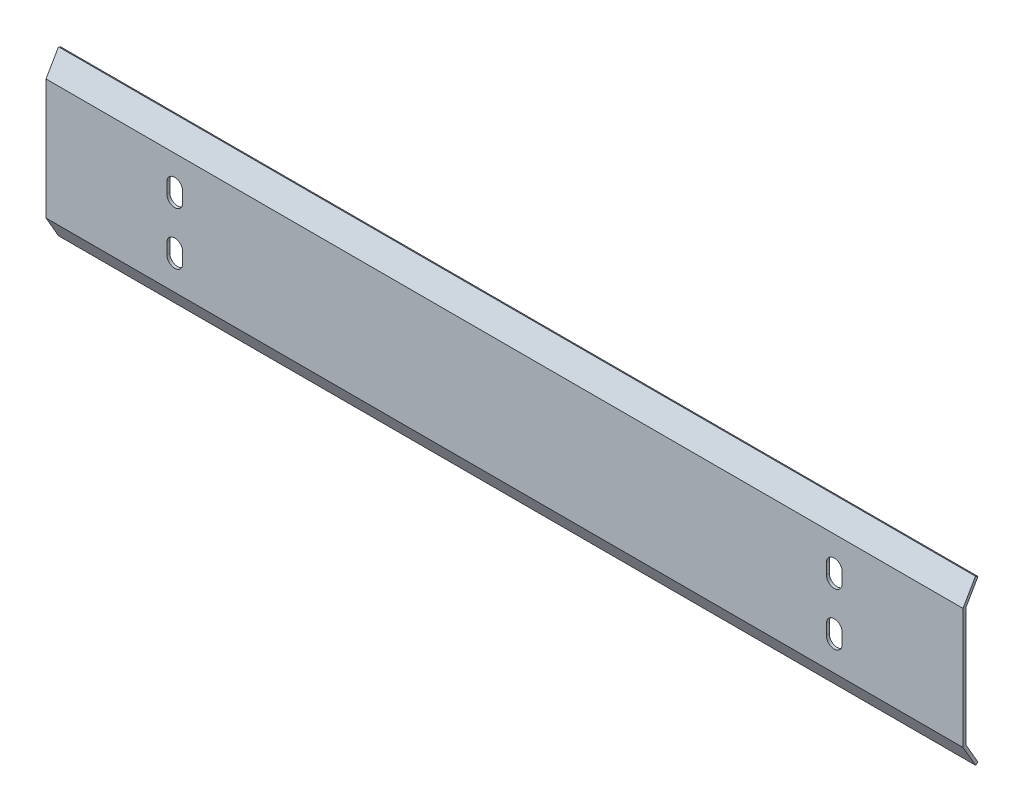
ISO-10303-21;
HEADER;
FILE_DESCRIPTION(('STEP AP214'),'2;1');
FILE_NAME('part.step','',(''),(''),'','','');
FILE_SCHEMA(('AUTOMOTIVE_DESIGN { 1 0 10303 214 1 1 1 1 }'));
ENDSEC;
DATA;
#1=APPLICATION_CONTEXT('core data for automotive mechanical design processes');
#2=APPLICATION_PROTOCOL_DEFINITION('international standard','automotive_design',2000,#1);
#3=PRODUCT_CONTEXT('',#1,'mechanical');
#4=PRODUCT('Part','Part','',(#3));
#5=PRODUCT_RELATED_PRODUCT_CATEGORY('part','',(#4));
#6=PRODUCT_DEFINITION_FORMATION('','',#4);
#7=PRODUCT_DEFINITION_CONTEXT('part definition',#1,'design');
#8=PRODUCT_DEFINITION('design','',#6,#7);
#9=PRODUCT_DEFINITION_SHAPE('','',#8);
#10=(LENGTH_UNIT() NAMED_UNIT(*) SI_UNIT(.MILLI.,.METRE.));
#11=(NAMED_UNIT(*) PLANE_ANGLE_UNIT() SI_UNIT($,.RADIAN.));
#12=(NAMED_UNIT(*) SI_UNIT($,.STERADIAN.) SOLID_ANGLE_UNIT());
#13=UNCERTAINTY_MEASURE_WITH_UNIT(LENGTH_MEASURE(1.E-05),#10,'distance_accuracy_value','');
#14=(GEOMETRIC_REPRESENTATION_CONTEXT(3) GLOBAL_UNCERTAINTY_ASSIGNED_CONTEXT((#13)) GLOBAL_UNIT_ASSIGNED_CONTEXT((#10,
#11,#12)) REPRESENTATION_CONTEXT('',''));
#15=CARTESIAN_POINT('',(0.,0.,0.));
#16=DIRECTION('',(0.,0.,1.));
#17=DIRECTION('',(1.,0.,0.));
#18=AXIS2_PLACEMENT_3D('',#15,#16,#17);
#19=CARTESIAN_POINT('',(-349.,0.294744111674232,-1.1));
#20=DIRECTION('',(0.,0.,-1.));
#21=DIRECTION('',(-1.,0.,0.));
#22=AXIS2_PLACEMENT_3D('',#19,#20,#21);
#23=PLANE('',#22);
#24=CARTESIAN_POINT('',(-300.,14.9227586640478,-1.1));
#25=DIRECTION('',(0.,0.,-1.));
#26=DIRECTION('',(-1.,0.,0.));
#27=AXIS2_PLACEMENT_3D('',#24,#25,#26);
#28=CIRCLE('',#27,3.);
#29=CARTESIAN_POINT('',(-303.,14.9227586640478,-1.1));
#30=VERTEX_POINT('',#29);
#31=CARTESIAN_POINT('',(-297.,14.9227586640478,-1.1));
#32=VERTEX_POINT('',#31);
#33=EDGE_CURVE('E229',#30,#32,#28,.T.);
#34=ORIENTED_EDGE('',*,*,#33,.F.);
#35=DIRECTION('',(0.,1.,0.));
#36=VECTOR('',#35,1.);
#37=CARTESIAN_POINT('',(-303.,0.294744111674232,-1.1));
#38=LINE('',#37,#36);
#39=CARTESIAN_POINT('',(-303.,10.9227586640478,-1.1));
#40=VERTEX_POINT('',#39);
#41=EDGE_CURVE('E222',#40,#30,#38,.T.);
#42=ORIENTED_EDGE('',*,*,#41,.F.);
#43=CARTESIAN_POINT('',(-300.,10.9227586640478,-1.1));
#44=DIRECTION('',(0.,0.,-1.));
#45=DIRECTION('',(-1.,0.,0.));
#46=AXIS2_PLACEMENT_3D('',#43,#44,#45);
#47=CIRCLE('',#46,3.);
#48=CARTESIAN_POINT('',(-297.,10.9227586640478,-1.1));
#49=VERTEX_POINT('',#48);
#50=EDGE_CURVE('E202',#49,#40,#47,.T.);
#51=ORIENTED_EDGE('',*,*,#50,.F.);
#52=DIRECTION('',(0.,-1.,0.));
#53=VECTOR('',#52,1.);
#54=CARTESIAN_POINT('',(-297.,0.294744111674232,-1.1));
#55=LINE('',#54,#53);
#56=EDGE_CURVE('E227',#32,#49,#55,.T.);
#57=ORIENTED_EDGE('',*,*,#56,.F.);
#58=EDGE_LOOP('',(#34,#42,#51,#57));
#59=FACE_BOUND('',#58,.T.);
#60=CARTESIAN_POINT('',(-49.,14.9227586640478,-1.1));
#61=DIRECTION('',(0.,0.,-1.));
#62=DIRECTION('',(-1.,0.,0.));
#63=AXIS2_PLACEMENT_3D('',#60,#61,#62);
#64=CIRCLE('',#63,3.);
#65=CARTESIAN_POINT('',(-52.,14.9227586640478,-1.1));
#66=VERTEX_POINT('',#65);
#67=CARTESIAN_POINT('',(-46.,14.9227586640478,-1.1));
#68=VERTEX_POINT('',#67);
#69=EDGE_CURVE('E324',#66,#68,#64,.T.);
#70=ORIENTED_EDGE('',*,*,#69,.F.);
#71=DIRECTION('',(0.,1.,0.));
#72=VECTOR('',#71,1.);
#73=CARTESIAN_POINT('',(-52.,0.294744111674232,-1.1));
#74=LINE('',#73,#72);
#75=CARTESIAN_POINT('',(-52.,10.9227586640478,-1.1));
#76=VERTEX_POINT('',#75);
#77=EDGE_CURVE('E311',#76,#66,#74,.T.);
#78=ORIENTED_EDGE('',*,*,#77,.F.);
#79=CARTESIAN_POINT('',(-49.,10.9227586640478,-1.1));
#80=DIRECTION('',(0.,0.,-1.));
#81=DIRECTION('',(-1.,0.,0.));
#82=AXIS2_PLACEMENT_3D('',#79,#80,#81);
#83=CIRCLE('',#82,3.);
#84=CARTESIAN_POINT('',(-46.,10.9227586640478,-1.1));
#85=VERTEX_POINT('',#84);
#86=EDGE_CURVE('E319',#85,#76,#83,.T.);
#87=ORIENTED_EDGE('',*,*,#86,.F.);
#88=DIRECTION('',(0.,-1.,0.));
#89=VECTOR('',#88,1.);
#90=CARTESIAN_POINT('',(-46.,0.294744111674232,-1.1));
#91=LINE('',#90,#89);
#92=EDGE_CURVE('E322',#68,#85,#91,.T.);
#93=ORIENTED_EDGE('',*,*,#92,.F.);
#94=EDGE_LOOP('',(#70,#78,#87,#93));
#95=FACE_BOUND('',#94,.T.);
#96=DIRECTION('',(0.,1.,0.));
#97=VECTOR('',#96,1.);
#98=CARTESIAN_POINT('',(0.,0.294744111674232,-1.1));
#99=LINE('',#98,#97);
#100=CARTESIAN_POINT('',(0.,0.294744111674232,-1.1));
#101=VERTEX_POINT('',#100);
#102=CARTESIAN_POINT('',(0.,45.5507732164214,-1.1));
#103=VERTEX_POINT('',#102);
#104=EDGE_CURVE('E326',#101,#103,#99,.T.);
#105=ORIENTED_EDGE('',*,*,#104,.F.);
#106=DIRECTION('',(1.,0.,0.));
#107=VECTOR('',#106,1.);
#108=CARTESIAN_POINT('',(-349.,0.294744111674232,-1.1));
#109=LINE('',#108,#107);
#110=CARTESIAN_POINT('',(-349.,0.294744111674232,-1.1));
#111=VERTEX_POINT('',#110);
#112=EDGE_CURVE('E11',#111,#101,#109,.T.);
#113=ORIENTED_EDGE('',*,*,#112,.F.);
#114=DIRECTION('',(0.,1.,0.));
#115=VECTOR('',#114,1.);
#116=CARTESIAN_POINT('',(-349.,0.294744111674232,-1.1));
#117=LINE('',#116,#115);
#118=CARTESIAN_POINT('',(-349.,45.5507732164214,-1.1));
#119=VERTEX_POINT('',#118);
#120=EDGE_CURVE('E327',#111,#119,#117,.T.);
#121=ORIENTED_EDGE('',*,*,#120,.T.);
#122=DIRECTION('',(1.,0.,0.));
#123=VECTOR('',#122,1.);
#124=CARTESIAN_POINT('',(-349.,45.5507732164214,-1.1));
#125=LINE('',#124,#123);
#126=EDGE_CURVE('E38',#119,#103,#125,.T.);
#127=ORIENTED_EDGE('',*,*,#126,.T.);
#128=EDGE_LOOP('',(#105,#113,#121,#127));
#129=FACE_BOUND('',#128,.T.);
#130=DIRECTION('',(0.,-1.,0.));
#131=VECTOR('',#130,1.);
#132=CARTESIAN_POINT('',(-52.,0.294744111674232,-1.1));
#133=LINE('',#132,#131);
#134=CARTESIAN_POINT('',(-52.,34.9227586640481,-1.1));
#135=VERTEX_POINT('',#134);
#136=CARTESIAN_POINT('',(-52.,30.9227586640481,-1.1));
#137=VERTEX_POINT('',#136);
#138=EDGE_CURVE('E291',#135,#137,#133,.T.);
#139=ORIENTED_EDGE('',*,*,#138,.T.);
#140=CARTESIAN_POINT('',(-49.,30.9227586640481,-1.1));
#141=DIRECTION('',(0.,0.,-1.));
#142=DIRECTION('',(-1.,0.,0.));
#143=AXIS2_PLACEMENT_3D('',#140,#141,#142);
#144=CIRCLE('',#143,3.);
#145=CARTESIAN_POINT('',(-46.,30.9227586640481,-1.1));
#146=VERTEX_POINT('',#145);
#147=EDGE_CURVE('E294',#137,#146,#144,.F.);
#148=ORIENTED_EDGE('',*,*,#147,.T.);
#149=DIRECTION('',(0.,1.,0.));
#150=VECTOR('',#149,1.);
#151=CARTESIAN_POINT('',(-46.,0.294744111674232,-1.1));
#152=LINE('',#151,#150);
#153=CARTESIAN_POINT('',(-46.,34.9227586640481,-1.1));
#154=VERTEX_POINT('',#153);
#155=EDGE_CURVE('E279',#146,#154,#152,.T.);
#156=ORIENTED_EDGE('',*,*,#155,.T.);
#157=CARTESIAN_POINT('',(-49.,34.9227586640481,-1.1));
#158=DIRECTION('',(0.,0.,-1.));
#159=DIRECTION('',(-1.,0.,0.));
#160=AXIS2_PLACEMENT_3D('',#157,#158,#159);
#161=CIRCLE('',#160,3.);
#162=EDGE_CURVE('E288',#154,#135,#161,.F.);
#163=ORIENTED_EDGE('',*,*,#162,.T.);
#164=EDGE_LOOP('',(#139,#148,#156,#163));
#165=FACE_BOUND('',#164,.T.);
#166=DIRECTION('',(0.,-1.,0.));
#167=VECTOR('',#166,1.);
#168=CARTESIAN_POINT('',(-303.,0.294744111674232,-1.1));
#169=LINE('',#168,#167);
#170=CARTESIAN_POINT('',(-303.,34.9227586640481,-1.1));
#171=VERTEX_POINT('',#170);
#172=CARTESIAN_POINT('',(-303.,30.9227586640481,-1.1));
#173=VERTEX_POINT('',#172);
#174=EDGE_CURVE('E258',#171,#173,#169,.T.);
#175=ORIENTED_EDGE('',*,*,#174,.T.);
#176=CARTESIAN_POINT('',(-300.,30.9227586640481,-1.1));
#177=DIRECTION('',(0.,0.,-1.));
#178=DIRECTION('',(-1.,0.,0.));
#179=AXIS2_PLACEMENT_3D('',#176,#177,#178);
#180=CIRCLE('',#179,3.);
#181=CARTESIAN_POINT('',(-297.,30.9227586640481,-1.1));
#182=VERTEX_POINT('',#181);
#183=EDGE_CURVE('E261',#173,#182,#180,.F.);
#184=ORIENTED_EDGE('',*,*,#183,.T.);
#185=DIRECTION('',(0.,1.,0.));
#186=VECTOR('',#185,1.);
#187=CARTESIAN_POINT('',(-297.,0.294744111674232,-1.1));
#188=LINE('',#187,#186);
#189=CARTESIAN_POINT('',(-297.,34.9227586640481,-1.1));
#190=VERTEX_POINT('',#189);
#191=EDGE_CURVE('E246',#182,#190,#188,.T.);
#192=ORIENTED_EDGE('',*,*,#191,.T.);
#193=CARTESIAN_POINT('',(-300.,34.9227586640481,-1.1));
#194=DIRECTION('',(0.,0.,-1.));
#195=DIRECTION('',(-1.,0.,0.));
#196=AXIS2_PLACEMENT_3D('',#193,#194,#195);
#197=CIRCLE('',#196,3.);
#198=EDGE_CURVE('E255',#190,#171,#197,.F.);
#199=ORIENTED_EDGE('',*,*,#198,.T.);
#200=EDGE_LOOP('',(#175,#184,#192,#199));
#201=FACE_BOUND('',#200,.T.);
#202=ADVANCED_FACE('F35',(#59,#95,#129,#165,#201),#23,.T.);
#203=CARTESIAN_POINT('',(-349.,0.,0.));
#204=DIRECTION('',(0.,0.,1.));
#205=DIRECTION('',(0.,-1.,0.));
#206=AXIS2_PLACEMENT_3D('',#203,#204,#205);
#207=PLANE('',#206);
#208=CARTESIAN_POINT('',(-300.,14.9227586640478,0.));
#209=DIRECTION('',(0.,0.,1.));
#210=DIRECTION('',(1.,0.,0.));
#211=AXIS2_PLACEMENT_3D('',#208,#209,#210);
#212=CIRCLE('',#211,3.);
#213=CARTESIAN_POINT('',(-297.,14.9227586640478,0.));
#214=VERTEX_POINT('',#213);
#215=CARTESIAN_POINT('',(-303.,14.9227586640478,0.));
#216=VERTEX_POINT('',#215);
#217=EDGE_CURVE('E59',#214,#216,#212,.T.);
#218=ORIENTED_EDGE('',*,*,#217,.F.);
#219=DIRECTION('',(0.,1.,0.));
#220=VECTOR('',#219,1.);
#221=CARTESIAN_POINT('',(-297.,14.9227586640478,0.));
#222=LINE('',#221,#220);
#223=CARTESIAN_POINT('',(-297.,10.9227586640478,0.));
#224=VERTEX_POINT('',#223);
#225=EDGE_CURVE('E215',#224,#214,#222,.T.);
#226=ORIENTED_EDGE('',*,*,#225,.F.);
#227=CARTESIAN_POINT('',(-300.,10.9227586640478,0.));
#228=DIRECTION('',(0.,0.,1.));
#229=DIRECTION('',(1.,0.,0.));
#230=AXIS2_PLACEMENT_3D('',#227,#228,#229);
#231=CIRCLE('',#230,3.);
#232=CARTESIAN_POINT('',(-303.,10.9227586640478,0.));
#233=VERTEX_POINT('',#232);
#234=EDGE_CURVE('E199',#233,#224,#231,.T.);
#235=ORIENTED_EDGE('',*,*,#234,.F.);
#236=DIRECTION('',(0.,-1.,0.));
#237=VECTOR('',#236,1.);
#238=CARTESIAN_POINT('',(-303.,14.9227586640478,0.));
#239=LINE('',#238,#237);
#240=EDGE_CURVE('E208',#216,#233,#239,.T.);
#241=ORIENTED_EDGE('',*,*,#240,.F.);
#242=EDGE_LOOP('',(#218,#226,#235,#241));
#243=FACE_BOUND('',#242,.T.);
#244=CARTESIAN_POINT('',(-49.,14.9227586640478,0.));
#245=DIRECTION('',(0.,0.,1.));
#246=DIRECTION('',(1.,0.,0.));
#247=AXIS2_PLACEMENT_3D('',#244,#245,#246);
#248=CIRCLE('',#247,3.);
#249=CARTESIAN_POINT('',(-46.,14.9227586640478,0.));
#250=VERTEX_POINT('',#249);
#251=CARTESIAN_POINT('',(-52.,14.9227586640478,0.));
#252=VERTEX_POINT('',#251);
#253=EDGE_CURVE('E297',#250,#252,#248,.T.);
#254=ORIENTED_EDGE('',*,*,#253,.F.);
#255=DIRECTION('',(0.,1.,0.));
#256=VECTOR('',#255,1.);
#257=CARTESIAN_POINT('',(-46.,14.9227586640478,0.));
#258=LINE('',#257,#256);
#259=CARTESIAN_POINT('',(-46.,10.9227586640478,0.));
#260=VERTEX_POINT('',#259);
#261=EDGE_CURVE('E305',#260,#250,#258,.T.);
#262=ORIENTED_EDGE('',*,*,#261,.F.);
#263=CARTESIAN_POINT('',(-49.,10.9227586640478,0.));
#264=DIRECTION('',(0.,0.,1.));
#265=DIRECTION('',(1.,0.,0.));
#266=AXIS2_PLACEMENT_3D('',#263,#264,#265);
#267=CIRCLE('',#266,3.);
#268=CARTESIAN_POINT('',(-52.,10.9227586640478,0.));
#269=VERTEX_POINT('',#268);
#270=EDGE_CURVE('E302',#269,#260,#267,.T.);
#271=ORIENTED_EDGE('',*,*,#270,.F.);
#272=DIRECTION('',(0.,-1.,0.));
#273=VECTOR('',#272,1.);
#274=CARTESIAN_POINT('',(-52.,14.9227586640478,0.));
#275=LINE('',#274,#273);
#276=EDGE_CURVE('E299',#252,#269,#275,.T.);
#277=ORIENTED_EDGE('',*,*,#276,.F.);
#278=EDGE_LOOP('',(#254,#262,#271,#277));
#279=FACE_BOUND('',#278,.T.);
#280=DIRECTION('',(0.,-1.,0.));
#281=VECTOR('',#280,1.);
#282=CARTESIAN_POINT('',(0.,0.,0.));
#283=LINE('',#282,#281);
#284=CARTESIAN_POINT('',(0.,45.8455173280956,0.));
#285=VERTEX_POINT('',#284);
#286=CARTESIAN_POINT('',(0.,0.,0.));
#287=VERTEX_POINT('',#286);
#288=EDGE_CURVE('E363',#285,#287,#283,.T.);
#289=ORIENTED_EDGE('',*,*,#288,.F.);
#290=DIRECTION('',(1.,0.,0.));
#291=VECTOR('',#290,1.);
#292=CARTESIAN_POINT('',(-349.,45.8455173280956,0.));
#293=LINE('',#292,#291);
#294=CARTESIAN_POINT('',(-349.,45.8455173280956,0.));
#295=VERTEX_POINT('',#294);
#296=EDGE_CURVE('E379',#295,#285,#293,.T.);
#297=ORIENTED_EDGE('',*,*,#296,.F.);
#298=DIRECTION('',(0.,-1.,0.));
#299=VECTOR('',#298,1.);
#300=CARTESIAN_POINT('',(-349.,0.,0.));
#301=LINE('',#300,#299);
#302=CARTESIAN_POINT('',(-349.,0.,0.));
#303=VERTEX_POINT('',#302);
#304=EDGE_CURVE('E340',#295,#303,#301,.T.);
#305=ORIENTED_EDGE('',*,*,#304,.T.);
#306=DIRECTION('',(1.,0.,0.));
#307=VECTOR('',#306,1.);
#308=CARTESIAN_POINT('',(-349.,0.,0.));
#309=LINE('',#308,#307);
#310=EDGE_CURVE('E377',#303,#287,#309,.T.);
#311=ORIENTED_EDGE('',*,*,#310,.T.);
#312=EDGE_LOOP('',(#289,#297,#305,#311));
#313=FACE_BOUND('',#312,.T.);
#314=DIRECTION('',(0.,-1.,0.));
#315=VECTOR('',#314,1.);
#316=CARTESIAN_POINT('',(-46.,30.9227586640481,0.));
#317=LINE('',#316,#315);
#318=CARTESIAN_POINT('',(-46.,34.9227586640481,0.));
#319=VERTEX_POINT('',#318);
#320=CARTESIAN_POINT('',(-46.,30.9227586640481,0.));
#321=VERTEX_POINT('',#320);
#322=EDGE_CURVE('E267',#319,#321,#317,.T.);
#323=ORIENTED_EDGE('',*,*,#322,.T.);
#324=CARTESIAN_POINT('',(-49.,30.9227586640481,0.));
#325=DIRECTION('',(0.,0.,-1.));
#326=DIRECTION('',(1.,0.,0.));
#327=AXIS2_PLACEMENT_3D('',#324,#325,#326);
#328=CIRCLE('',#327,3.);
#329=CARTESIAN_POINT('',(-52.,30.9227586640481,0.));
#330=VERTEX_POINT('',#329);
#331=EDGE_CURVE('E264',#321,#330,#328,.T.);
#332=ORIENTED_EDGE('',*,*,#331,.T.);
#333=DIRECTION('',(0.,1.,0.));
#334=VECTOR('',#333,1.);
#335=CARTESIAN_POINT('',(-52.,30.9227586640481,0.));
#336=LINE('',#335,#334);
#337=CARTESIAN_POINT('',(-52.,34.9227586640481,0.));
#338=VERTEX_POINT('',#337);
#339=EDGE_CURVE('E273',#330,#338,#336,.T.);
#340=ORIENTED_EDGE('',*,*,#339,.T.);
#341=CARTESIAN_POINT('',(-49.,34.9227586640481,0.));
#342=DIRECTION('',(0.,0.,-1.));
#343=DIRECTION('',(1.,0.,0.));
#344=AXIS2_PLACEMENT_3D('',#341,#342,#343);
#345=CIRCLE('',#344,3.);
#346=EDGE_CURVE('E270',#338,#319,#345,.T.);
#347=ORIENTED_EDGE('',*,*,#346,.T.);
#348=EDGE_LOOP('',(#323,#332,#340,#347));
#349=FACE_BOUND('',#348,.T.);
#350=DIRECTION('',(0.,-1.,0.));
#351=VECTOR('',#350,1.);
#352=CARTESIAN_POINT('',(-297.,30.9227586640481,0.));
#353=LINE('',#352,#351);
#354=CARTESIAN_POINT('',(-297.,34.9227586640481,0.));
#355=VERTEX_POINT('',#354);
#356=CARTESIAN_POINT('',(-297.,30.9227586640481,0.));
#357=VERTEX_POINT('',#356);
#358=EDGE_CURVE('E234',#355,#357,#353,.T.);
#359=ORIENTED_EDGE('',*,*,#358,.T.);
#360=CARTESIAN_POINT('',(-300.,30.9227586640481,0.));
#361=DIRECTION('',(0.,0.,-1.));
#362=DIRECTION('',(1.,0.,0.));
#363=AXIS2_PLACEMENT_3D('',#360,#361,#362);
#364=CIRCLE('',#363,3.);
#365=CARTESIAN_POINT('',(-303.,30.9227586640481,0.));
#366=VERTEX_POINT('',#365);
#367=EDGE_CURVE('E231',#357,#366,#364,.T.);
#368=ORIENTED_EDGE('',*,*,#367,.T.);
#369=DIRECTION('',(0.,1.,0.));
#370=VECTOR('',#369,1.);
#371=CARTESIAN_POINT('',(-303.,30.9227586640481,0.));
#372=LINE('',#371,#370);
#373=CARTESIAN_POINT('',(-303.,34.9227586640481,0.));
#374=VERTEX_POINT('',#373);
#375=EDGE_CURVE('E240',#366,#374,#372,.T.);
#376=ORIENTED_EDGE('',*,*,#375,.T.);
#377=CARTESIAN_POINT('',(-300.,34.9227586640481,0.));
#378=DIRECTION('',(0.,0.,-1.));
#379=DIRECTION('',(1.,0.,0.));
#380=AXIS2_PLACEMENT_3D('',#377,#378,#379);
#381=CIRCLE('',#380,3.);
#382=EDGE_CURVE('E237',#374,#355,#381,.T.);
#383=ORIENTED_EDGE('',*,*,#382,.T.);
#384=EDGE_LOOP('',(#359,#368,#376,#383));
#385=FACE_BOUND('',#384,.T.);
#386=ADVANCED_FACE('F212',(#243,#279,#313,#349,#385),#207,.T.);
#387=CARTESIAN_POINT('',(-349.,0.294744111674232,-1.1));
#388=DIRECTION('',(0.,0.499999999999995,-0.866025403784442));
#389=DIRECTION('',(0.,0.866025403784442,0.499999999999995));
#390=AXIS2_PLACEMENT_3D('',#387,#388,#389);
#391=PLANE('',#390);
#392=DIRECTION('',(0.,0.866025403784442,0.499999999999995));
#393=VECTOR('',#392,1.);
#394=CARTESIAN_POINT('',(0.,0.294744111674232,-1.1));
#395=LINE('',#394,#393);
#396=CARTESIAN_POINT('',(0.,-7.67724133595221,-5.70262794416284));
#397=VERTEX_POINT('',#396);
#398=EDGE_CURVE('E331',#397,#101,#395,.T.);
#399=ORIENTED_EDGE('',*,*,#398,.F.);
#400=DIRECTION('',(1.,0.,0.));
#401=VECTOR('',#400,1.);
#402=CARTESIAN_POINT('',(-349.,-7.67724133595221,-5.70262794416284));
#403=LINE('',#402,#401);
#404=CARTESIAN_POINT('',(-349.,-7.67724133595221,-5.70262794416284));
#405=VERTEX_POINT('',#404);
#406=EDGE_CURVE('E43',#405,#397,#403,.T.);
#407=ORIENTED_EDGE('',*,*,#406,.F.);
#408=DIRECTION('',(0.,0.866025403784442,0.499999999999995));
#409=VECTOR('',#408,1.);
#410=CARTESIAN_POINT('',(-349.,0.294744111674232,-1.1));
#411=LINE('',#410,#409);
#412=EDGE_CURVE('E349',#405,#111,#411,.T.);
#413=ORIENTED_EDGE('',*,*,#412,.T.);
#414=ORIENTED_EDGE('',*,*,#112,.T.);
#415=EDGE_LOOP('',(#399,#407,#413,#414));
#416=FACE_BOUND('',#415,.T.);
#417=ADVANCED_FACE('F397',(#416),#391,.T.);
#418=CARTESIAN_POINT('',(-349.,-8.2272413359522,-4.74999999999995));
#419=DIRECTION('',(0.,-0.866025403784444,-0.499999999999991));
#420=DIRECTION('',(0.,0.499999999999991,-0.866025403784444));
#421=AXIS2_PLACEMENT_3D('',#418,#419,#420);
#422=PLANE('',#421);
#423=DIRECTION('',(0.,0.499999999999991,-0.866025403784444));
#424=VECTOR('',#423,1.);
#425=CARTESIAN_POINT('',(0.,-8.2272413359522,-4.74999999999995));
#426=LINE('',#425,#424);
#427=CARTESIAN_POINT('',(0.,-8.2272413359522,-4.74999999999995));
#428=VERTEX_POINT('',#427);
#429=EDGE_CURVE('E369',#428,#397,#426,.T.);
#430=ORIENTED_EDGE('',*,*,#429,.F.);
#431=DIRECTION('',(1.,0.,0.));
#432=VECTOR('',#431,1.);
#433=CARTESIAN_POINT('',(-349.,-8.2272413359522,-4.74999999999995));
#434=LINE('',#433,#432);
#435=CARTESIAN_POINT('',(-349.,-8.2272413359522,-4.74999999999995));
#436=VERTEX_POINT('',#435);
#437=EDGE_CURVE('E375',#436,#428,#434,.T.);
#438=ORIENTED_EDGE('',*,*,#437,.F.);
#439=DIRECTION('',(0.,0.499999999999991,-0.866025403784444));
#440=VECTOR('',#439,1.);
#441=CARTESIAN_POINT('',(-349.,-8.2272413359522,-4.74999999999995));
#442=LINE('',#441,#440);
#443=EDGE_CURVE('E346',#436,#405,#442,.T.);
#444=ORIENTED_EDGE('',*,*,#443,.T.);
#445=ORIENTED_EDGE('',*,*,#406,.T.);
#446=EDGE_LOOP('',(#430,#438,#444,#445));
#447=FACE_BOUND('',#446,.T.);
#448=ADVANCED_FACE('F418',(#447),#422,.T.);
#449=CARTESIAN_POINT('',(-349.,0.,0.));
#450=DIRECTION('',(0.,-0.499999999999995,0.866025403784442));
#451=DIRECTION('',(0.,-0.866025403784442,-0.499999999999995));
#452=AXIS2_PLACEMENT_3D('',#449,#450,#451);
#453=PLANE('',#452);
#454=DIRECTION('',(0.,-0.866025403784442,-0.499999999999995));
#455=VECTOR('',#454,1.);
#456=CARTESIAN_POINT('',(0.,0.,0.));
#457=LINE('',#456,#455);
#458=EDGE_CURVE('E366',#287,#428,#457,.T.);
#459=ORIENTED_EDGE('',*,*,#458,.F.);
#460=ORIENTED_EDGE('',*,*,#310,.F.);
#461=DIRECTION('',(0.,-0.866025403784442,-0.499999999999995));
#462=VECTOR('',#461,1.);
#463=CARTESIAN_POINT('',(-349.,0.,0.));
#464=LINE('',#463,#462);
#465=EDGE_CURVE('E343',#303,#436,#464,.T.);
#466=ORIENTED_EDGE('',*,*,#465,.T.);
#467=ORIENTED_EDGE('',*,*,#437,.T.);
#468=EDGE_LOOP('',(#459,#460,#466,#467));
#469=FACE_BOUND('',#468,.T.);
#470=ADVANCED_FACE('F416',(#469),#453,.T.);
#471=CARTESIAN_POINT('',(-349.,45.8455173280956,0.));
#472=DIRECTION('',(0.,0.500000000000001,0.866025403784438));
#473=DIRECTION('',(0.,-0.866025403784438,0.500000000000001));
#474=AXIS2_PLACEMENT_3D('',#471,#472,#473);
#475=PLANE('',#474);
#476=DIRECTION('',(0.,-0.866025403784438,0.500000000000001));
#477=VECTOR('',#476,1.);
#478=CARTESIAN_POINT('',(0.,45.8455173280956,0.));
#479=LINE('',#478,#477);
#480=CARTESIAN_POINT('',(0.,54.0727586640478,-4.75000000000001));
#481=VERTEX_POINT('',#480);
#482=EDGE_CURVE('E360',#481,#285,#479,.T.);
#483=ORIENTED_EDGE('',*,*,#482,.F.);
#484=DIRECTION('',(1.,0.,0.));
#485=VECTOR('',#484,1.);
#486=CARTESIAN_POINT('',(-349.,54.0727586640478,-4.75000000000001));
#487=LINE('',#486,#485);
#488=CARTESIAN_POINT('',(-349.,54.0727586640478,-4.75000000000001));
#489=VERTEX_POINT('',#488);
#490=EDGE_CURVE('E381',#489,#481,#487,.T.);
#491=ORIENTED_EDGE('',*,*,#490,.F.);
#492=DIRECTION('',(0.,-0.866025403784438,0.500000000000001));
#493=VECTOR('',#492,1.);
#494=CARTESIAN_POINT('',(-349.,45.8455173280956,0.));
#495=LINE('',#494,#493);
#496=EDGE_CURVE('E337',#489,#295,#495,.T.);
#497=ORIENTED_EDGE('',*,*,#496,.T.);
#498=ORIENTED_EDGE('',*,*,#296,.T.);
#499=EDGE_LOOP('',(#483,#491,#497,#498));
#500=FACE_BOUND('',#499,.T.);
#501=ADVANCED_FACE('F410',(#500),#475,.T.);
#502=CARTESIAN_POINT('',(-349.,53.5227586640478,-5.70262794416288));
#503=DIRECTION('',(0.,0.866025403784438,-0.500000000000001));
#504=DIRECTION('',(0.,0.500000000000001,0.866025403784438));
#505=AXIS2_PLACEMENT_3D('',#502,#503,#504);
#506=PLANE('',#505);
#507=DIRECTION('',(0.,0.500000000000001,0.866025403784438));
#508=VECTOR('',#507,1.);
#509=CARTESIAN_POINT('',(0.,53.5227586640478,-5.70262794416288));
#510=LINE('',#509,#508);
#511=CARTESIAN_POINT('',(0.,53.5227586640478,-5.70262794416288));
#512=VERTEX_POINT('',#511);
#513=EDGE_CURVE('E357',#512,#481,#510,.T.);
#514=ORIENTED_EDGE('',*,*,#513,.F.);
#515=DIRECTION('',(1.,0.,0.));
#516=VECTOR('',#515,1.);
#517=CARTESIAN_POINT('',(-349.,53.5227586640478,-5.70262794416288));
#518=LINE('',#517,#516);
#519=CARTESIAN_POINT('',(-349.,53.5227586640478,-5.70262794416288));
#520=VERTEX_POINT('',#519);
#521=EDGE_CURVE('E382',#520,#512,#518,.T.);
#522=ORIENTED_EDGE('',*,*,#521,.F.);
#523=DIRECTION('',(0.,0.500000000000001,0.866025403784438));
#524=VECTOR('',#523,1.);
#525=CARTESIAN_POINT('',(-349.,53.5227586640478,-5.70262794416288));
#526=LINE('',#525,#524);
#527=EDGE_CURVE('E334',#520,#489,#526,.T.);
#528=ORIENTED_EDGE('',*,*,#527,.T.);
#529=ORIENTED_EDGE('',*,*,#490,.T.);
#530=EDGE_LOOP('',(#514,#522,#528,#529));
#531=FACE_BOUND('',#530,.T.);
#532=ADVANCED_FACE('F406',(#531),#506,.T.);
#533=CARTESIAN_POINT('',(-349.,45.5507732164214,-1.1));
#534=DIRECTION('',(0.,-0.5,-0.866025403784439));
#535=DIRECTION('',(0.,0.866025403784439,-0.5));
#536=AXIS2_PLACEMENT_3D('',#533,#534,#535);
#537=PLANE('',#536);
#538=DIRECTION('',(0.,0.866025403784439,-0.5));
#539=VECTOR('',#538,1.);
#540=CARTESIAN_POINT('',(0.,45.5507732164214,-1.1));
#541=LINE('',#540,#539);
#542=EDGE_CURVE('E354',#103,#512,#541,.T.);
#543=ORIENTED_EDGE('',*,*,#542,.F.);
#544=ORIENTED_EDGE('',*,*,#126,.F.);
#545=DIRECTION('',(0.,0.866025403784439,-0.5));
#546=VECTOR('',#545,1.);
#547=CARTESIAN_POINT('',(-349.,45.5507732164214,-1.1));
#548=LINE('',#547,#546);
#549=EDGE_CURVE('E330',#119,#520,#548,.T.);
#550=ORIENTED_EDGE('',*,*,#549,.T.);
#551=ORIENTED_EDGE('',*,*,#521,.T.);
#552=EDGE_LOOP('',(#543,#544,#550,#551));
#553=FACE_BOUND('',#552,.T.);
#554=ADVANCED_FACE('F391',(#553),#537,.T.);
#555=CARTESIAN_POINT('',(-349.,0.,0.));
#556=DIRECTION('',(1.,0.,0.));
#557=DIRECTION('',(0.,0.,-1.));
#558=AXIS2_PLACEMENT_3D('',#555,#556,#557);
#559=PLANE('',#558);
#560=ORIENTED_EDGE('',*,*,#120,.F.);
#561=ORIENTED_EDGE('',*,*,#412,.F.);
#562=ORIENTED_EDGE('',*,*,#443,.F.);
#563=ORIENTED_EDGE('',*,*,#465,.F.);
#564=ORIENTED_EDGE('',*,*,#304,.F.);
#565=ORIENTED_EDGE('',*,*,#496,.F.);
#566=ORIENTED_EDGE('',*,*,#527,.F.);
#567=ORIENTED_EDGE('',*,*,#549,.F.);
#568=EDGE_LOOP('',(#560,#561,#562,#563,#564,#565,#566,#567));
#569=FACE_BOUND('',#568,.T.);
#570=ADVANCED_FACE('F400',(#569),#559,.F.);
#571=CARTESIAN_POINT('',(0.,0.,0.));
#572=DIRECTION('',(1.,0.,0.));
#573=DIRECTION('',(0.,0.,-1.));
#574=AXIS2_PLACEMENT_3D('',#571,#572,#573);
#575=PLANE('',#574);
#576=ORIENTED_EDGE('',*,*,#104,.T.);
#577=ORIENTED_EDGE('',*,*,#542,.T.);
#578=ORIENTED_EDGE('',*,*,#513,.T.);
#579=ORIENTED_EDGE('',*,*,#482,.T.);
#580=ORIENTED_EDGE('',*,*,#288,.T.);
#581=ORIENTED_EDGE('',*,*,#458,.T.);
#582=ORIENTED_EDGE('',*,*,#429,.T.);
#583=ORIENTED_EDGE('',*,*,#398,.T.);
#584=EDGE_LOOP('',(#576,#577,#578,#579,#580,#581,#582,#583));
#585=FACE_BOUND('',#584,.T.);
#586=ADVANCED_FACE('F393',(#585),#575,.T.);
#587=CARTESIAN_POINT('',(-49.,14.9227586640478,-10.));
#588=DIRECTION('',(0.,0.,1.));
#589=DIRECTION('',(1.,0.,0.));
#590=AXIS2_PLACEMENT_3D('',#587,#588,#589);
#591=CYLINDRICAL_SURFACE('',#590,3.);
#592=ORIENTED_EDGE('',*,*,#69,.T.);
#593=DIRECTION('',(0.,0.,1.));
#594=VECTOR('',#593,1.);
#595=CARTESIAN_POINT('',(-46.,14.9227586640478,-10.));
#596=LINE('',#595,#594);
#597=EDGE_CURVE('E309',#68,#250,#596,.T.);
#598=ORIENTED_EDGE('',*,*,#597,.T.);
#599=ORIENTED_EDGE('',*,*,#253,.T.);
#600=DIRECTION('',(0.,0.,1.));
#601=VECTOR('',#600,1.);
#602=CARTESIAN_POINT('',(-52.,14.9227586640478,-10.));
#603=LINE('',#602,#601);
#604=EDGE_CURVE('E308',#66,#252,#603,.T.);
#605=ORIENTED_EDGE('',*,*,#604,.F.);
#606=EDGE_LOOP('',(#592,#598,#599,#605));
#607=FACE_BOUND('',#606,.T.);
#608=ADVANCED_FACE('F443',(#607),#591,.F.);
#609=CARTESIAN_POINT('',(-46.,14.9227586640478,-10.));
#610=DIRECTION('',(1.,0.,0.));
#611=DIRECTION('',(0.,0.,-1.));
#612=AXIS2_PLACEMENT_3D('',#609,#610,#611);
#613=PLANE('',#612);
#614=ORIENTED_EDGE('',*,*,#92,.T.);
#615=DIRECTION('',(0.,0.,1.));
#616=VECTOR('',#615,1.);
#617=CARTESIAN_POINT('',(-46.,10.9227586640478,-10.));
#618=LINE('',#617,#616);
#619=EDGE_CURVE('E312',#85,#260,#618,.T.);
#620=ORIENTED_EDGE('',*,*,#619,.T.);
#621=ORIENTED_EDGE('',*,*,#261,.T.);
#622=ORIENTED_EDGE('',*,*,#597,.F.);
#623=EDGE_LOOP('',(#614,#620,#621,#622));
#624=FACE_BOUND('',#623,.T.);
#625=ADVANCED_FACE('F445',(#624),#613,.F.);
#626=CARTESIAN_POINT('',(-49.,10.9227586640478,-10.));
#627=DIRECTION('',(0.,0.,1.));
#628=DIRECTION('',(1.,0.,0.));
#629=AXIS2_PLACEMENT_3D('',#626,#627,#628);
#630=CYLINDRICAL_SURFACE('',#629,3.);
#631=ORIENTED_EDGE('',*,*,#86,.T.);
#632=DIRECTION('',(0.,0.,1.));
#633=VECTOR('',#632,1.);
#634=CARTESIAN_POINT('',(-52.,10.9227586640478,-10.));
#635=LINE('',#634,#633);
#636=EDGE_CURVE('E314',#76,#269,#635,.T.);
#637=ORIENTED_EDGE('',*,*,#636,.T.);
#638=ORIENTED_EDGE('',*,*,#270,.T.);
#639=ORIENTED_EDGE('',*,*,#619,.F.);
#640=EDGE_LOOP('',(#631,#637,#638,#639));
#641=FACE_BOUND('',#640,.T.);
#642=ADVANCED_FACE('F454',(#641),#630,.F.);
#643=CARTESIAN_POINT('',(-52.,14.9227586640478,-10.));
#644=DIRECTION('',(-1.,0.,0.));
#645=DIRECTION('',(0.,0.,1.));
#646=AXIS2_PLACEMENT_3D('',#643,#644,#645);
#647=PLANE('',#646);
#648=ORIENTED_EDGE('',*,*,#77,.T.);
#649=ORIENTED_EDGE('',*,*,#604,.T.);
#650=ORIENTED_EDGE('',*,*,#276,.T.);
#651=ORIENTED_EDGE('',*,*,#636,.F.);
#652=EDGE_LOOP('',(#648,#649,#650,#651));
#653=FACE_BOUND('',#652,.T.);
#654=ADVANCED_FACE('F452',(#653),#647,.F.);
#655=CARTESIAN_POINT('',(-49.,30.9227586640481,-10.0000000000001));
#656=DIRECTION('',(0.,0.,1.));
#657=DIRECTION('',(0.,-1.,0.));
#658=AXIS2_PLACEMENT_3D('',#655,#656,#657);
#659=CYLINDRICAL_SURFACE('',#658,3.);
#660=DIRECTION('',(0.,0.,1.));
#661=VECTOR('',#660,1.);
#662=CARTESIAN_POINT('',(-52.,30.9227586640481,-10.0000000000001));
#663=LINE('',#662,#661);
#664=EDGE_CURVE('E277',#137,#330,#663,.T.);
#665=ORIENTED_EDGE('',*,*,#664,.T.);
#666=ORIENTED_EDGE('',*,*,#331,.F.);
#667=DIRECTION('',(0.,0.,1.));
#668=VECTOR('',#667,1.);
#669=CARTESIAN_POINT('',(-46.,30.9227586640481,-10.0000000000001));
#670=LINE('',#669,#668);
#671=EDGE_CURVE('E276',#146,#321,#670,.T.);
#672=ORIENTED_EDGE('',*,*,#671,.F.);
#673=ORIENTED_EDGE('',*,*,#147,.F.);
#674=EDGE_LOOP('',(#665,#666,#672,#673));
#675=FACE_BOUND('',#674,.T.);
#676=ADVANCED_FACE('F461',(#675),#659,.F.);
#677=CARTESIAN_POINT('',(-52.,30.9227586640481,-10.0000000000001));
#678=DIRECTION('',(1.,0.,0.));
#679=DIRECTION('',(0.,0.,-1.));
#680=AXIS2_PLACEMENT_3D('',#677,#678,#679);
#681=PLANE('',#680);
#682=DIRECTION('',(0.,0.,1.));
#683=VECTOR('',#682,1.);
#684=CARTESIAN_POINT('',(-52.,34.9227586640481,-10.0000000000001));
#685=LINE('',#684,#683);
#686=EDGE_CURVE('E280',#135,#338,#685,.T.);
#687=ORIENTED_EDGE('',*,*,#686,.T.);
#688=ORIENTED_EDGE('',*,*,#339,.F.);
#689=ORIENTED_EDGE('',*,*,#664,.F.);
#690=ORIENTED_EDGE('',*,*,#138,.F.);
#691=EDGE_LOOP('',(#687,#688,#689,#690));
#692=FACE_BOUND('',#691,.T.);
#693=ADVANCED_FACE('F503',(#692),#681,.T.);
#694=CARTESIAN_POINT('',(-49.,34.9227586640481,-10.0000000000001));
#695=DIRECTION('',(0.,0.,1.));
#696=DIRECTION('',(0.,-1.,0.));
#697=AXIS2_PLACEMENT_3D('',#694,#695,#696);
#698=CYLINDRICAL_SURFACE('',#697,3.);
#699=DIRECTION('',(0.,0.,1.));
#700=VECTOR('',#699,1.);
#701=CARTESIAN_POINT('',(-46.,34.9227586640481,-10.0000000000001));
#702=LINE('',#701,#700);
#703=EDGE_CURVE('E282',#154,#319,#702,.T.);
#704=ORIENTED_EDGE('',*,*,#703,.T.);
#705=ORIENTED_EDGE('',*,*,#346,.F.);
#706=ORIENTED_EDGE('',*,*,#686,.F.);
#707=ORIENTED_EDGE('',*,*,#162,.F.);
#708=EDGE_LOOP('',(#704,#705,#706,#707));
#709=FACE_BOUND('',#708,.T.);
#710=ADVANCED_FACE('F512',(#709),#698,.F.);
#711=CARTESIAN_POINT('',(-46.,30.9227586640481,-10.0000000000001));
#712=DIRECTION('',(-1.,0.,0.));
#713=DIRECTION('',(0.,0.,1.));
#714=AXIS2_PLACEMENT_3D('',#711,#712,#713);
#715=PLANE('',#714);
#716=ORIENTED_EDGE('',*,*,#671,.T.);
#717=ORIENTED_EDGE('',*,*,#322,.F.);
#718=ORIENTED_EDGE('',*,*,#703,.F.);
#719=ORIENTED_EDGE('',*,*,#155,.F.);
#720=EDGE_LOOP('',(#716,#717,#718,#719));
#721=FACE_BOUND('',#720,.T.);
#722=ADVANCED_FACE('F522',(#721),#715,.T.);
#723=CARTESIAN_POINT('',(-300.,30.9227586640481,-10.0000000000001));
#724=DIRECTION('',(0.,0.,1.));
#725=DIRECTION('',(0.,-1.,0.));
#726=AXIS2_PLACEMENT_3D('',#723,#724,#725);
#727=CYLINDRICAL_SURFACE('',#726,3.);
#728=DIRECTION('',(0.,0.,1.));
#729=VECTOR('',#728,1.);
#730=CARTESIAN_POINT('',(-303.,30.9227586640481,-10.0000000000001));
#731=LINE('',#730,#729);
#732=EDGE_CURVE('E244',#173,#366,#731,.T.);
#733=ORIENTED_EDGE('',*,*,#732,.T.);
#734=ORIENTED_EDGE('',*,*,#367,.F.);
#735=DIRECTION('',(0.,0.,1.));
#736=VECTOR('',#735,1.);
#737=CARTESIAN_POINT('',(-297.,30.9227586640481,-10.0000000000001));
#738=LINE('',#737,#736);
#739=EDGE_CURVE('E243',#182,#357,#738,.T.);
#740=ORIENTED_EDGE('',*,*,#739,.F.);
#741=ORIENTED_EDGE('',*,*,#183,.F.);
#742=EDGE_LOOP('',(#733,#734,#740,#741));
#743=FACE_BOUND('',#742,.T.);
#744=ADVANCED_FACE('F531',(#743),#727,.F.);
#745=CARTESIAN_POINT('',(-303.,30.9227586640481,-10.0000000000001));
#746=DIRECTION('',(1.,0.,0.));
#747=DIRECTION('',(0.,0.,-1.));
#748=AXIS2_PLACEMENT_3D('',#745,#746,#747);
#749=PLANE('',#748);
#750=DIRECTION('',(0.,0.,1.));
#751=VECTOR('',#750,1.);
#752=CARTESIAN_POINT('',(-303.,34.9227586640481,-10.0000000000001));
#753=LINE('',#752,#751);
#754=EDGE_CURVE('E247',#171,#374,#753,.T.);
#755=ORIENTED_EDGE('',*,*,#754,.T.);
#756=ORIENTED_EDGE('',*,*,#375,.F.);
#757=ORIENTED_EDGE('',*,*,#732,.F.);
#758=ORIENTED_EDGE('',*,*,#174,.F.);
#759=EDGE_LOOP('',(#755,#756,#757,#758));
#760=FACE_BOUND('',#759,.T.);
#761=ADVANCED_FACE('F554',(#760),#749,.T.);
#762=CARTESIAN_POINT('',(-300.,34.9227586640481,-10.0000000000001));
#763=DIRECTION('',(0.,0.,1.));
#764=DIRECTION('',(0.,-1.,0.));
#765=AXIS2_PLACEMENT_3D('',#762,#763,#764);
#766=CYLINDRICAL_SURFACE('',#765,3.);
#767=DIRECTION('',(0.,0.,1.));
#768=VECTOR('',#767,1.);
#769=CARTESIAN_POINT('',(-297.,34.9227586640481,-10.0000000000001));
#770=LINE('',#769,#768);
#771=EDGE_CURVE('E249',#190,#355,#770,.T.);
#772=ORIENTED_EDGE('',*,*,#771,.T.);
#773=ORIENTED_EDGE('',*,*,#382,.F.);
#774=ORIENTED_EDGE('',*,*,#754,.F.);
#775=ORIENTED_EDGE('',*,*,#198,.F.);
#776=EDGE_LOOP('',(#772,#773,#774,#775));
#777=FACE_BOUND('',#776,.T.);
#778=ADVANCED_FACE('F564',(#777),#766,.F.);
#779=CARTESIAN_POINT('',(-297.,30.9227586640481,-10.0000000000001));
#780=DIRECTION('',(-1.,0.,0.));
#781=DIRECTION('',(0.,0.,1.));
#782=AXIS2_PLACEMENT_3D('',#779,#780,#781);
#783=PLANE('',#782);
#784=ORIENTED_EDGE('',*,*,#739,.T.);
#785=ORIENTED_EDGE('',*,*,#358,.F.);
#786=ORIENTED_EDGE('',*,*,#771,.F.);
#787=ORIENTED_EDGE('',*,*,#191,.F.);
#788=EDGE_LOOP('',(#784,#785,#786,#787));
#789=FACE_BOUND('',#788,.T.);
#790=ADVANCED_FACE('F574',(#789),#783,.T.);
#791=CARTESIAN_POINT('',(-300.,14.9227586640478,-10.));
#792=DIRECTION('',(0.,0.,1.));
#793=DIRECTION('',(1.,0.,0.));
#794=AXIS2_PLACEMENT_3D('',#791,#792,#793);
#795=CYLINDRICAL_SURFACE('',#794,3.);
#796=ORIENTED_EDGE('',*,*,#33,.T.);
#797=DIRECTION('',(0.,0.,1.));
#798=VECTOR('',#797,1.);
#799=CARTESIAN_POINT('',(-297.,14.9227586640478,-10.));
#800=LINE('',#799,#798);
#801=EDGE_CURVE('E220',#32,#214,#800,.T.);
#802=ORIENTED_EDGE('',*,*,#801,.T.);
#803=ORIENTED_EDGE('',*,*,#217,.T.);
#804=DIRECTION('',(0.,0.,1.));
#805=VECTOR('',#804,1.);
#806=CARTESIAN_POINT('',(-303.,14.9227586640478,-10.));
#807=LINE('',#806,#805);
#808=EDGE_CURVE('E205',#30,#216,#807,.T.);
#809=ORIENTED_EDGE('',*,*,#808,.F.);
#810=EDGE_LOOP('',(#796,#802,#803,#809));
#811=FACE_BOUND('',#810,.T.);
#812=ADVANCED_FACE('F584',(#811),#795,.F.);
#813=CARTESIAN_POINT('',(-297.,14.9227586640478,-10.));
#814=DIRECTION('',(1.,0.,0.));
#815=DIRECTION('',(0.,0.,-1.));
#816=AXIS2_PLACEMENT_3D('',#813,#814,#815);
#817=PLANE('',#816);
#818=ORIENTED_EDGE('',*,*,#56,.T.);
#819=DIRECTION('',(0.,0.,1.));
#820=VECTOR('',#819,1.);
#821=CARTESIAN_POINT('',(-297.,10.9227586640478,-10.));
#822=LINE('',#821,#820);
#823=EDGE_CURVE('E204',#49,#224,#822,.T.);
#824=ORIENTED_EDGE('',*,*,#823,.T.);
#825=ORIENTED_EDGE('',*,*,#225,.T.);
#826=ORIENTED_EDGE('',*,*,#801,.F.);
#827=EDGE_LOOP('',(#818,#824,#825,#826));
#828=FACE_BOUND('',#827,.T.);
#829=ADVANCED_FACE('F594',(#828),#817,.F.);
#830=CARTESIAN_POINT('',(-300.,10.9227586640478,-10.));
#831=DIRECTION('',(0.,0.,1.));
#832=DIRECTION('',(1.,0.,0.));
#833=AXIS2_PLACEMENT_3D('',#830,#831,#832);
#834=CYLINDRICAL_SURFACE('',#833,3.);
#835=ORIENTED_EDGE('',*,*,#50,.T.);
#836=DIRECTION('',(0.,0.,1.));
#837=VECTOR('',#836,1.);
#838=CARTESIAN_POINT('',(-303.,10.9227586640478,-10.));
#839=LINE('',#838,#837);
#840=EDGE_CURVE('E51',#40,#233,#839,.T.);
#841=ORIENTED_EDGE('',*,*,#840,.T.);
#842=ORIENTED_EDGE('',*,*,#234,.T.);
#843=ORIENTED_EDGE('',*,*,#823,.F.);
#844=EDGE_LOOP('',(#835,#841,#842,#843));
#845=FACE_BOUND('',#844,.T.);
#846=ADVANCED_FACE('F196',(#845),#834,.F.);
#847=CARTESIAN_POINT('',(-303.,14.9227586640478,-10.));
#848=DIRECTION('',(-1.,0.,0.));
#849=DIRECTION('',(0.,0.,1.));
#850=AXIS2_PLACEMENT_3D('',#847,#848,#849);
#851=PLANE('',#850);
#852=ORIENTED_EDGE('',*,*,#41,.T.);
#853=ORIENTED_EDGE('',*,*,#808,.T.);
#854=ORIENTED_EDGE('',*,*,#240,.T.);
#855=ORIENTED_EDGE('',*,*,#840,.F.);
#856=EDGE_LOOP('',(#852,#853,#854,#855));
#857=FACE_BOUND('',#856,.T.);
#858=ADVANCED_FACE('F209',(#857),#851,.F.);
#859=CLOSED_SHELL('',(#202,#386,#417,#448,#470,#501,#532,#554,#570,#586,#608,#625,#642,#654,
#676,#693,#710,#722,#744,#761,#778,#790,#812,#829,#846,#858));
#860=MANIFOLD_SOLID_BREP('B2',#859);
#861=ADVANCED_BREP_SHAPE_REPRESENTATION('',(#18,#860),#14);
#862=SHAPE_DEFINITION_REPRESENTATION(#9,#861);
ENDSEC;
END-ISO-10303-21;
